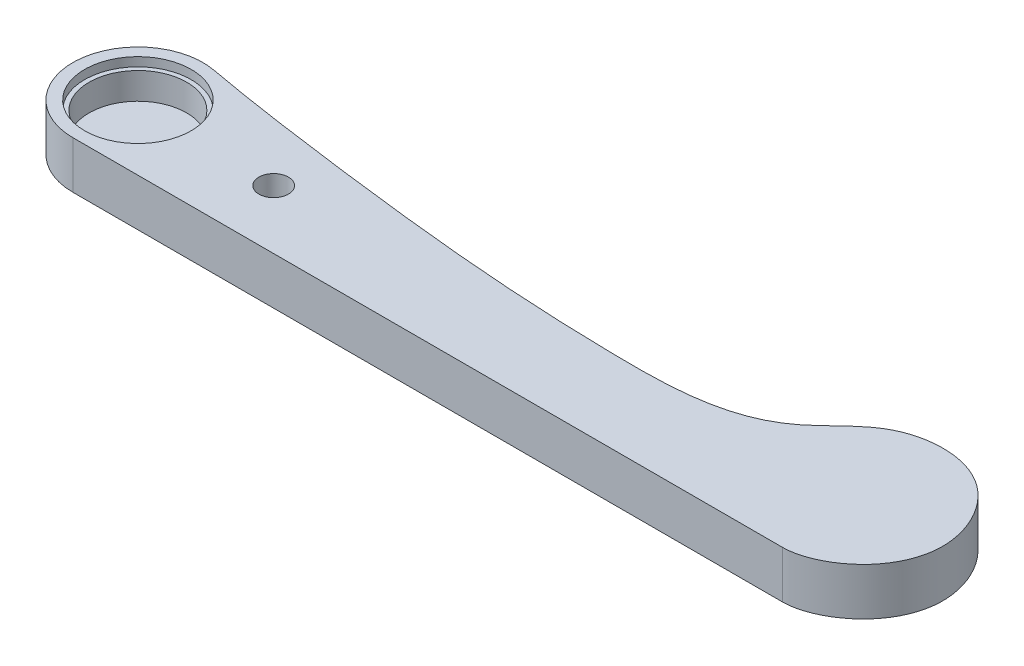
ISO-10303-21;
HEADER;
FILE_DESCRIPTION(('STEP AP214'),'2;1');
FILE_NAME('part.step','',(''),(''),'','','');
FILE_SCHEMA(('AUTOMOTIVE_DESIGN { 1 0 10303 214 1 1 1 1 }'));
ENDSEC;
DATA;
#1=APPLICATION_CONTEXT('core data for automotive mechanical design processes');
#2=APPLICATION_PROTOCOL_DEFINITION('international standard','automotive_design',2000,#1);
#3=PRODUCT_CONTEXT('',#1,'mechanical');
#4=PRODUCT('Part','Part','',(#3));
#5=PRODUCT_RELATED_PRODUCT_CATEGORY('part','',(#4));
#6=PRODUCT_DEFINITION_FORMATION('','',#4);
#7=PRODUCT_DEFINITION_CONTEXT('part definition',#1,'design');
#8=PRODUCT_DEFINITION('design','',#6,#7);
#9=PRODUCT_DEFINITION_SHAPE('','',#8);
#10=(LENGTH_UNIT() NAMED_UNIT(*) SI_UNIT(.MILLI.,.METRE.));
#11=(NAMED_UNIT(*) PLANE_ANGLE_UNIT() SI_UNIT($,.RADIAN.));
#12=(NAMED_UNIT(*) SI_UNIT($,.STERADIAN.) SOLID_ANGLE_UNIT());
#13=UNCERTAINTY_MEASURE_WITH_UNIT(LENGTH_MEASURE(1.E-05),#10,'distance_accuracy_value','');
#14=(GEOMETRIC_REPRESENTATION_CONTEXT(3) GLOBAL_UNCERTAINTY_ASSIGNED_CONTEXT((#13)) GLOBAL_UNIT_ASSIGNED_CONTEXT((#10,
#11,#12)) REPRESENTATION_CONTEXT('',''));
#15=CARTESIAN_POINT('',(0.,0.,0.));
#16=DIRECTION('',(0.,0.,1.));
#17=DIRECTION('',(1.,0.,0.));
#18=AXIS2_PLACEMENT_3D('',#15,#16,#17);
#19=CARTESIAN_POINT('',(120.,8.,11.));
#20=CARTESIAN_POINT('',(123.030412890409,8.,11.));
#21=CARTESIAN_POINT('',(129.995145537586,8.,7.67407177696641));
#22=CARTESIAN_POINT('',(135.565165281553,8.,-3.47066139784673));
#23=CARTESIAN_POINT('',(127.873824028342,8.,-17.9482785409781));
#24=CARTESIAN_POINT('',(111.445141049397,8.,-17.4753133657044));
#25=CARTESIAN_POINT('',(100.604507807391,8.,-3.16782425089446));
#26=CARTESIAN_POINT('',(69.6619482217541,8.,-2.5328335480062));
#27=CARTESIAN_POINT('',(39.051870869682,8.,-5.22960885091331));
#28=CARTESIAN_POINT('',(9.7359098396425,8.,-9.35195071826054));
#29=CARTESIAN_POINT('',(2.04650265510634,8.,-10.8079520207411));
#30=B_SPLINE_CURVE_WITH_KNOTS('',3,(#19,#20,#21,#22,#23,#24,#25,#26,#27,#28,#29),.UNSPECIFIED.,
.F.,.F.,(4,1,1,1,1,1,1,1,4),(0.,0.0612173214508802,0.121805656876796,0.214935430499955,
0.303540356796583,0.37275384786497,0.529128729679655,0.815195139143431,1.),.UNSPECIFIED.);
#31=DIRECTION('',(0.,-1.,0.));
#32=VECTOR('',#31,1.);
#33=SURFACE_OF_LINEAR_EXTRUSION('',#30,#32);
#34=CARTESIAN_POINT('',(120.,0.,11.));
#35=CARTESIAN_POINT('',(123.030412890409,0.,11.));
#36=CARTESIAN_POINT('',(129.995145537586,0.,7.67407177696641));
#37=CARTESIAN_POINT('',(135.565165281553,0.,-3.47066139784673));
#38=CARTESIAN_POINT('',(127.873824028342,0.,-17.9482785409781));
#39=CARTESIAN_POINT('',(111.445141049397,0.,-17.4753133657044));
#40=CARTESIAN_POINT('',(100.604507807391,0.,-3.16782425089446));
#41=CARTESIAN_POINT('',(69.6619482217541,0.,-2.5328335480062));
#42=CARTESIAN_POINT('',(39.051870869682,0.,-5.22960885091331));
#43=CARTESIAN_POINT('',(9.7359098396425,0.,-9.35195071826054));
#44=CARTESIAN_POINT('',(2.04650265510634,0.,-10.8079520207411));
#45=B_SPLINE_CURVE_WITH_KNOTS('',3,(#34,#35,#36,#37,#38,#39,#40,#41,#42,#43,#44),.UNSPECIFIED.,
.F.,.F.,(4,1,1,1,1,1,1,1,4),(0.,0.0612173214508802,0.121805656876796,0.214935430499955,
0.303540356796583,0.37275384786497,0.529128729679655,0.815195139143431,1.),.UNSPECIFIED.);
#46=CARTESIAN_POINT('',(120.,0.,11.));
#47=VERTEX_POINT('',#46);
#48=CARTESIAN_POINT('',(2.04650265510634,0.,-10.8079520207411));
#49=VERTEX_POINT('',#48);
#50=EDGE_CURVE('E81',#47,#49,#45,.T.);
#51=ORIENTED_EDGE('',*,*,#50,.T.);
#52=DIRECTION('',(0.,-1.,0.));
#53=VECTOR('',#52,1.);
#54=CARTESIAN_POINT('',(2.04650265510634,8.,-10.8079520207411));
#55=LINE('',#54,#53);
#56=CARTESIAN_POINT('',(2.04650265510634,8.,-10.8079520207411));
#57=VERTEX_POINT('',#56);
#58=EDGE_CURVE('E11',#57,#49,#55,.T.);
#59=ORIENTED_EDGE('',*,*,#58,.F.);
#60=CARTESIAN_POINT('',(120.,8.,11.));
#61=VERTEX_POINT('',#60);
#62=EDGE_CURVE('E75',#61,#57,#30,.T.);
#63=ORIENTED_EDGE('',*,*,#62,.F.);
#64=DIRECTION('',(0.,-1.,0.));
#65=VECTOR('',#64,1.);
#66=CARTESIAN_POINT('',(120.,8.,11.));
#67=LINE('',#66,#65);
#68=EDGE_CURVE('E82',#61,#47,#67,.T.);
#69=ORIENTED_EDGE('',*,*,#68,.T.);
#70=EDGE_LOOP('',(#51,#59,#63,#69));
#71=FACE_BOUND('',#70,.T.);
#72=ADVANCED_FACE('F34',(#71),#33,.F.);
#73=CARTESIAN_POINT('',(0.,8.,0.));
#74=DIRECTION('',(0.,-1.,0.));
#75=DIRECTION('',(0.,0.,-1.));
#76=AXIS2_PLACEMENT_3D('',#73,#74,#75);
#77=CYLINDRICAL_SURFACE('',#76,11.);
#78=CARTESIAN_POINT('',(0.,0.,0.));
#79=DIRECTION('',(0.,1.,0.));
#80=DIRECTION('',(0.,0.,1.));
#81=AXIS2_PLACEMENT_3D('',#78,#79,#80);
#82=CIRCLE('',#81,11.);
#83=CARTESIAN_POINT('',(0.,0.,11.));
#84=VERTEX_POINT('',#83);
#85=EDGE_CURVE('E63',#49,#84,#82,.T.);
#86=ORIENTED_EDGE('',*,*,#85,.T.);
#87=DIRECTION('',(0.,-1.,0.));
#88=VECTOR('',#87,1.);
#89=CARTESIAN_POINT('',(0.,8.,11.));
#90=LINE('',#89,#88);
#91=CARTESIAN_POINT('',(0.,8.,11.));
#92=VERTEX_POINT('',#91);
#93=EDGE_CURVE('E43',#92,#84,#90,.T.);
#94=ORIENTED_EDGE('',*,*,#93,.F.);
#95=CARTESIAN_POINT('',(0.,8.,0.));
#96=DIRECTION('',(0.,1.,0.));
#97=DIRECTION('',(0.,0.,1.));
#98=AXIS2_PLACEMENT_3D('',#95,#96,#97);
#99=CIRCLE('',#98,11.);
#100=EDGE_CURVE('E71',#57,#92,#99,.T.);
#101=ORIENTED_EDGE('',*,*,#100,.F.);
#102=ORIENTED_EDGE('',*,*,#58,.T.);
#103=EDGE_LOOP('',(#86,#94,#101,#102));
#104=FACE_BOUND('',#103,.T.);
#105=ADVANCED_FACE('F72',(#104),#77,.T.);
#106=CARTESIAN_POINT('',(0.,8.,11.));
#107=DIRECTION('',(0.,0.,-1.));
#108=DIRECTION('',(-1.,0.,0.));
#109=AXIS2_PLACEMENT_3D('',#106,#107,#108);
#110=PLANE('',#109);
#111=DIRECTION('',(1.,0.,0.));
#112=VECTOR('',#111,1.);
#113=CARTESIAN_POINT('',(0.,0.,11.));
#114=LINE('',#113,#112);
#115=EDGE_CURVE('E68',#84,#47,#114,.T.);
#116=ORIENTED_EDGE('',*,*,#115,.T.);
#117=ORIENTED_EDGE('',*,*,#68,.F.);
#118=DIRECTION('',(1.,0.,0.));
#119=VECTOR('',#118,1.);
#120=CARTESIAN_POINT('',(0.,8.,11.));
#121=LINE('',#120,#119);
#122=EDGE_CURVE('E51',#92,#61,#121,.T.);
#123=ORIENTED_EDGE('',*,*,#122,.F.);
#124=ORIENTED_EDGE('',*,*,#93,.T.);
#125=EDGE_LOOP('',(#116,#117,#123,#124));
#126=FACE_BOUND('',#125,.T.);
#127=ADVANCED_FACE('F98',(#126),#110,.F.);
#128=CARTESIAN_POINT('',(83.1192893096246,8.,-2.99826245540003));
#129=DIRECTION('',(0.,-1.,0.));
#130=DIRECTION('',(0.,0.,-1.));
#131=AXIS2_PLACEMENT_3D('',#128,#129,#130);
#132=PLANE('',#131);
#133=CARTESIAN_POINT('',(24.,8.,1.04786262980429));
#134=DIRECTION('',(0.,-1.,0.));
#135=DIRECTION('',(0.,0.,-1.));
#136=AXIS2_PLACEMENT_3D('',#133,#134,#135);
#137=CIRCLE('',#136,2.5);
#138=CARTESIAN_POINT('',(24.,8.,-1.4521373701957));
#139=VERTEX_POINT('',#138);
#140=EDGE_CURVE('E201',#139,#139,#137,.F.);
#141=ORIENTED_EDGE('',*,*,#140,.F.);
#142=EDGE_LOOP('',(#141));
#143=FACE_BOUND('',#142,.T.);
#144=CARTESIAN_POINT('',(0.,8.,0.));
#145=DIRECTION('',(0.,1.,0.));
#146=DIRECTION('',(0.,0.,1.));
#147=AXIS2_PLACEMENT_3D('',#144,#145,#146);
#148=CIRCLE('',#147,9.);
#149=CARTESIAN_POINT('',(0.,8.,9.));
#150=VERTEX_POINT('',#149);
#151=EDGE_CURVE('E88',#150,#150,#148,.T.);
#152=ORIENTED_EDGE('',*,*,#151,.F.);
#153=EDGE_LOOP('',(#152));
#154=FACE_BOUND('',#153,.T.);
#155=ORIENTED_EDGE('',*,*,#62,.T.);
#156=ORIENTED_EDGE('',*,*,#100,.T.);
#157=ORIENTED_EDGE('',*,*,#122,.T.);
#158=EDGE_LOOP('',(#155,#156,#157));
#159=FACE_BOUND('',#158,.T.);
#160=ADVANCED_FACE('F78',(#143,#154,#159),#132,.F.);
#161=CARTESIAN_POINT('',(83.1192893096246,0.,-2.99826245540003));
#162=DIRECTION('',(0.,-1.,0.));
#163=DIRECTION('',(0.,0.,-1.));
#164=AXIS2_PLACEMENT_3D('',#161,#162,#163);
#165=PLANE('',#164);
#166=CARTESIAN_POINT('',(24.,0.,1.04786262980429));
#167=DIRECTION('',(0.,-1.,0.));
#168=DIRECTION('',(0.,0.,-1.));
#169=AXIS2_PLACEMENT_3D('',#166,#167,#168);
#170=CIRCLE('',#169,2.5);
#171=CARTESIAN_POINT('',(24.,0.,-1.4521373701957));
#172=VERTEX_POINT('',#171);
#173=EDGE_CURVE('E205',#172,#172,#170,.T.);
#174=ORIENTED_EDGE('',*,*,#173,.F.);
#175=EDGE_LOOP('',(#174));
#176=FACE_BOUND('',#175,.T.);
#177=ORIENTED_EDGE('',*,*,#50,.F.);
#178=ORIENTED_EDGE('',*,*,#115,.F.);
#179=ORIENTED_EDGE('',*,*,#85,.F.);
#180=EDGE_LOOP('',(#177,#178,#179));
#181=FACE_BOUND('',#180,.T.);
#182=ADVANCED_FACE('F99',(#176,#181),#165,.T.);
#183=CARTESIAN_POINT('',(0.,6.5,0.));
#184=DIRECTION('',(0.,1.,0.));
#185=DIRECTION('',(0.,0.,1.));
#186=AXIS2_PLACEMENT_3D('',#183,#184,#185);
#187=CYLINDRICAL_SURFACE('',#186,9.);
#188=CARTESIAN_POINT('',(0.,6.5,0.));
#189=DIRECTION('',(0.,1.,0.));
#190=DIRECTION('',(0.,0.,1.));
#191=AXIS2_PLACEMENT_3D('',#188,#189,#190);
#192=CIRCLE('',#191,9.);
#193=CARTESIAN_POINT('',(0.,6.5,9.));
#194=VERTEX_POINT('',#193);
#195=EDGE_CURVE('E84',#194,#194,#192,.T.);
#196=ORIENTED_EDGE('',*,*,#195,.F.);
#197=EDGE_LOOP('',(#196));
#198=FACE_BOUND('',#197,.T.);
#199=ORIENTED_EDGE('',*,*,#151,.T.);
#200=EDGE_LOOP('',(#199));
#201=FACE_BOUND('',#200,.T.);
#202=ADVANCED_FACE('F101',(#198,#201),#187,.F.);
#203=CARTESIAN_POINT('',(0.,6.5,0.));
#204=DIRECTION('',(0.,1.,0.));
#205=DIRECTION('',(0.,0.,1.));
#206=AXIS2_PLACEMENT_3D('',#203,#204,#205);
#207=PLANE('',#206);
#208=CARTESIAN_POINT('',(0.,6.5,0.));
#209=DIRECTION('',(0.,1.,0.));
#210=DIRECTION('',(0.,0.,1.));
#211=AXIS2_PLACEMENT_3D('',#208,#209,#210);
#212=CIRCLE('',#211,8.24999999999999);
#213=CARTESIAN_POINT('',(0.,6.5,8.24999999999999));
#214=VERTEX_POINT('',#213);
#215=EDGE_CURVE('E184',#214,#214,#212,.T.);
#216=ORIENTED_EDGE('',*,*,#215,.F.);
#217=EDGE_LOOP('',(#216));
#218=FACE_BOUND('',#217,.T.);
#219=ORIENTED_EDGE('',*,*,#195,.T.);
#220=EDGE_LOOP('',(#219));
#221=FACE_BOUND('',#220,.T.);
#222=ADVANCED_FACE('F108',(#218,#221),#207,.T.);
#223=CARTESIAN_POINT('',(0.,2.,0.));
#224=DIRECTION('',(0.,1.,0.));
#225=DIRECTION('',(0.,0.,1.));
#226=AXIS2_PLACEMENT_3D('',#223,#224,#225);
#227=CYLINDRICAL_SURFACE('',#226,8.24999999999999);
#228=CARTESIAN_POINT('',(0.,2.,0.));
#229=DIRECTION('',(0.,1.,0.));
#230=DIRECTION('',(0.,0.,1.));
#231=AXIS2_PLACEMENT_3D('',#228,#229,#230);
#232=CIRCLE('',#231,8.24999999999999);
#233=CARTESIAN_POINT('',(0.,2.,8.24999999999999));
#234=VERTEX_POINT('',#233);
#235=EDGE_CURVE('E190',#234,#234,#232,.T.);
#236=ORIENTED_EDGE('',*,*,#235,.F.);
#237=EDGE_LOOP('',(#236));
#238=FACE_BOUND('',#237,.T.);
#239=ORIENTED_EDGE('',*,*,#215,.T.);
#240=EDGE_LOOP('',(#239));
#241=FACE_BOUND('',#240,.T.);
#242=ADVANCED_FACE('F156',(#238,#241),#227,.F.);
#243=CARTESIAN_POINT('',(0.,2.,0.));
#244=DIRECTION('',(0.,1.,0.));
#245=DIRECTION('',(0.,0.,1.));
#246=AXIS2_PLACEMENT_3D('',#243,#244,#245);
#247=PLANE('',#246);
#248=ORIENTED_EDGE('',*,*,#235,.T.);
#249=EDGE_LOOP('',(#248));
#250=FACE_BOUND('',#249,.T.);
#251=ADVANCED_FACE('F135',(#250),#247,.T.);
#252=CARTESIAN_POINT('',(24.,8.001,1.04786262980429));
#253=DIRECTION('',(0.,-1.,0.));
#254=DIRECTION('',(0.,0.,-1.));
#255=AXIS2_PLACEMENT_3D('',#252,#253,#254);
#256=CYLINDRICAL_SURFACE('',#255,2.5);
#257=ORIENTED_EDGE('',*,*,#173,.T.);
#258=EDGE_LOOP('',(#257));
#259=FACE_BOUND('',#258,.T.);
#260=ORIENTED_EDGE('',*,*,#140,.T.);
#261=EDGE_LOOP('',(#260));
#262=FACE_BOUND('',#261,.T.);
#263=ADVANCED_FACE('F145',(#259,#262),#256,.F.);
#264=CLOSED_SHELL('',(#72,#105,#127,#160,#182,#202,#222,#242,#251,#263));
#265=MANIFOLD_SOLID_BREP('B2',#264);
#266=ADVANCED_BREP_SHAPE_REPRESENTATION('',(#18,#265),#14);
#267=SHAPE_DEFINITION_REPRESENTATION(#9,#266);
ENDSEC;
END-ISO-10303-21;
